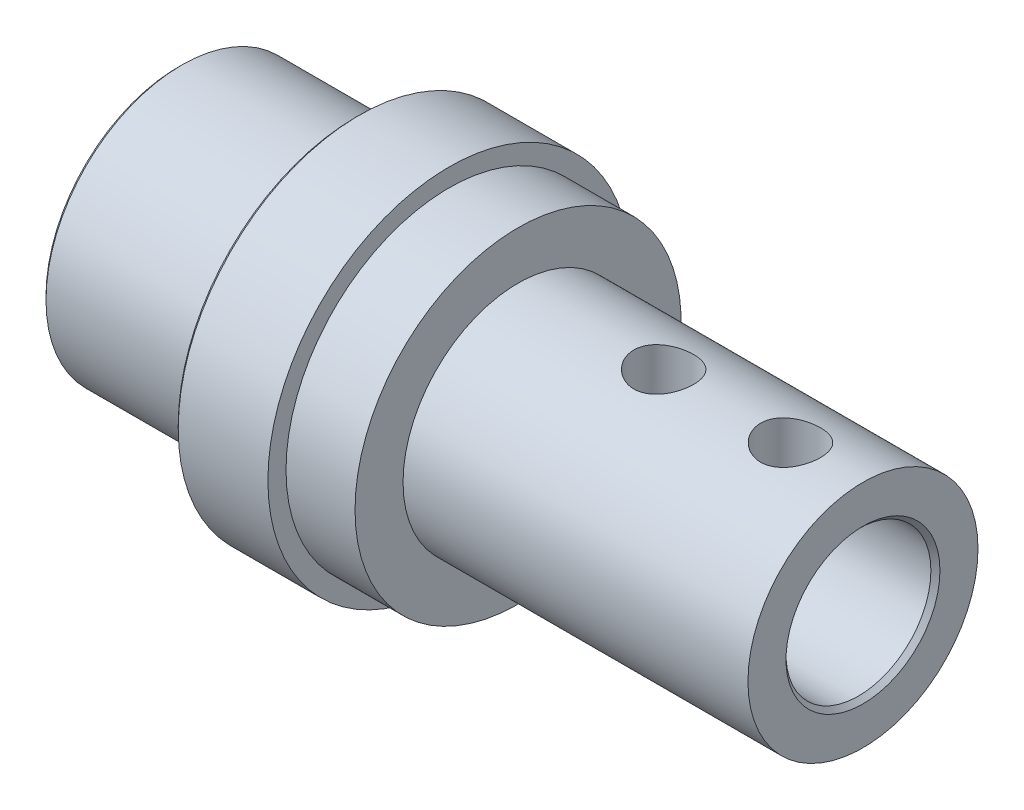
ISO-10303-21;
HEADER;
FILE_DESCRIPTION(('STEP AP214'),'2;1');
FILE_NAME('part.step','',(''),(''),'','','');
FILE_SCHEMA(('AUTOMOTIVE_DESIGN { 1 0 10303 214 1 1 1 1 }'));
ENDSEC;
DATA;
#1=APPLICATION_CONTEXT('core data for automotive mechanical design processes');
#2=APPLICATION_PROTOCOL_DEFINITION('international standard','automotive_design',2000,#1);
#3=PRODUCT_CONTEXT('',#1,'mechanical');
#4=PRODUCT('Part','Part','',(#3));
#5=PRODUCT_RELATED_PRODUCT_CATEGORY('part','',(#4));
#6=PRODUCT_DEFINITION_FORMATION('','',#4);
#7=PRODUCT_DEFINITION_CONTEXT('part definition',#1,'design');
#8=PRODUCT_DEFINITION('design','',#6,#7);
#9=PRODUCT_DEFINITION_SHAPE('','',#8);
#10=(LENGTH_UNIT() NAMED_UNIT(*) SI_UNIT(.MILLI.,.METRE.));
#11=(NAMED_UNIT(*) PLANE_ANGLE_UNIT() SI_UNIT($,.RADIAN.));
#12=(NAMED_UNIT(*) SI_UNIT($,.STERADIAN.) SOLID_ANGLE_UNIT());
#13=UNCERTAINTY_MEASURE_WITH_UNIT(LENGTH_MEASURE(1.E-05),#10,'distance_accuracy_value','');
#14=(GEOMETRIC_REPRESENTATION_CONTEXT(3) GLOBAL_UNCERTAINTY_ASSIGNED_CONTEXT((#13)) GLOBAL_UNIT_ASSIGNED_CONTEXT((#10,
#11,#12)) REPRESENTATION_CONTEXT('',''));
#15=CARTESIAN_POINT('',(0.,0.,0.));
#16=DIRECTION('',(0.,0.,1.));
#17=DIRECTION('',(1.,0.,0.));
#18=AXIS2_PLACEMENT_3D('',#15,#16,#17);
#19=CARTESIAN_POINT('',(16.5,0.,10.2));
#20=DIRECTION('',(1.,0.,0.));
#21=DIRECTION('',(0.,0.,-1.));
#22=AXIS2_PLACEMENT_3D('',#19,#20,#21);
#23=CYLINDRICAL_SURFACE('',#22,10.);
#24=CARTESIAN_POINT('',(-11.3000000000002,0.,10.2));
#25=DIRECTION('',(-1.,0.,0.));
#26=DIRECTION('',(0.,0.,1.));
#27=AXIS2_PLACEMENT_3D('',#24,#25,#26);
#28=CIRCLE('',#27,10.);
#29=CARTESIAN_POINT('',(-11.3000000000002,0.,20.2));
#30=VERTEX_POINT('',#29);
#31=EDGE_CURVE('E92',#30,#30,#28,.F.);
#32=ORIENTED_EDGE('',*,*,#31,.T.);
#33=EDGE_LOOP('',(#32));
#34=FACE_BOUND('',#33,.T.);
#35=CARTESIAN_POINT('',(-6.35,0.,10.2));
#36=DIRECTION('',(-1.,0.,0.));
#37=DIRECTION('',(0.,0.,1.));
#38=AXIS2_PLACEMENT_3D('',#35,#36,#37);
#39=CIRCLE('',#38,10.);
#40=CARTESIAN_POINT('',(-6.35,0.,20.2));
#41=VERTEX_POINT('',#40);
#42=EDGE_CURVE('E225',#41,#41,#39,.T.);
#43=ORIENTED_EDGE('',*,*,#42,.T.);
#44=EDGE_LOOP('',(#43));
#45=FACE_BOUND('',#44,.T.);
#46=ADVANCED_FACE('F46',(#34,#45),#23,.T.);
#47=CARTESIAN_POINT('',(-11.5000000000002,0.,1.7));
#48=DIRECTION('',(-1.,0.,0.));
#49=DIRECTION('',(0.,0.,1.));
#50=AXIS2_PLACEMENT_3D('',#47,#48,#49);
#51=PLANE('',#50);
#52=CARTESIAN_POINT('',(-11.5000000000002,0.,10.2));
#53=DIRECTION('',(-1.,0.,0.));
#54=DIRECTION('',(0.,0.,1.));
#55=AXIS2_PLACEMENT_3D('',#52,#53,#54);
#56=CIRCLE('',#55,9.79999999999999);
#57=CARTESIAN_POINT('',(-11.5000000000002,0.,20.));
#58=VERTEX_POINT('',#57);
#59=EDGE_CURVE('E96',#58,#58,#56,.T.);
#60=ORIENTED_EDGE('',*,*,#59,.T.);
#61=EDGE_LOOP('',(#60));
#62=FACE_BOUND('',#61,.T.);
#63=CARTESIAN_POINT('',(-11.5000000000002,0.,10.2));
#64=DIRECTION('',(1.,0.,0.));
#65=DIRECTION('',(0.,0.,-1.));
#66=AXIS2_PLACEMENT_3D('',#63,#64,#65);
#67=CIRCLE('',#66,8.49999999999999);
#68=CARTESIAN_POINT('',(-11.5000000000002,0.,1.7));
#69=VERTEX_POINT('',#68);
#70=EDGE_CURVE('E82',#69,#69,#67,.T.);
#71=ORIENTED_EDGE('',*,*,#70,.T.);
#72=EDGE_LOOP('',(#71));
#73=FACE_BOUND('',#72,.T.);
#74=ADVANCED_FACE('F130',(#62,#73),#51,.T.);
#75=CARTESIAN_POINT('',(16.5,0.,10.2));
#76=DIRECTION('',(1.,0.,0.));
#77=DIRECTION('',(0.,0.,-1.));
#78=AXIS2_PLACEMENT_3D('',#75,#76,#77);
#79=CYLINDRICAL_SURFACE('',#78,8.5);
#80=CARTESIAN_POINT('',(-12.3000000000002,0.,10.2));
#81=DIRECTION('',(-1.,0.,0.));
#82=DIRECTION('',(0.,0.,1.));
#83=AXIS2_PLACEMENT_3D('',#80,#81,#82);
#84=CIRCLE('',#83,8.5);
#85=CARTESIAN_POINT('',(-12.3000000000002,0.,18.7));
#86=VERTEX_POINT('',#85);
#87=EDGE_CURVE('E100',#86,#86,#84,.F.);
#88=ORIENTED_EDGE('',*,*,#87,.T.);
#89=EDGE_LOOP('',(#88));
#90=FACE_BOUND('',#89,.T.);
#91=ORIENTED_EDGE('',*,*,#70,.F.);
#92=EDGE_LOOP('',(#91));
#93=FACE_BOUND('',#92,.T.);
#94=ADVANCED_FACE('F136',(#90,#93),#79,.T.);
#95=CARTESIAN_POINT('',(-12.5000000000002,0.,2.7));
#96=DIRECTION('',(-1.,0.,0.));
#97=DIRECTION('',(0.,0.,1.));
#98=AXIS2_PLACEMENT_3D('',#95,#96,#97);
#99=PLANE('',#98);
#100=CARTESIAN_POINT('',(-12.5000000000002,0.,10.2));
#101=DIRECTION('',(-1.,0.,0.));
#102=DIRECTION('',(0.,0.,1.));
#103=AXIS2_PLACEMENT_3D('',#100,#101,#102);
#104=CIRCLE('',#103,8.29999999999998);
#105=CARTESIAN_POINT('',(-12.5000000000002,0.,18.5));
#106=VERTEX_POINT('',#105);
#107=EDGE_CURVE('E104',#106,#106,#104,.T.);
#108=ORIENTED_EDGE('',*,*,#107,.T.);
#109=EDGE_LOOP('',(#108));
#110=FACE_BOUND('',#109,.T.);
#111=CARTESIAN_POINT('',(-12.5000000000003,0.,10.2));
#112=DIRECTION('',(1.,0.,0.));
#113=DIRECTION('',(0.,0.,-1.));
#114=AXIS2_PLACEMENT_3D('',#111,#112,#113);
#115=CIRCLE('',#114,7.5);
#116=CARTESIAN_POINT('',(-12.5000000000003,0.,2.7));
#117=VERTEX_POINT('',#116);
#118=EDGE_CURVE('E75',#117,#117,#115,.T.);
#119=ORIENTED_EDGE('',*,*,#118,.T.);
#120=EDGE_LOOP('',(#119));
#121=FACE_BOUND('',#120,.T.);
#122=ADVANCED_FACE('F170',(#110,#121),#99,.T.);
#123=CARTESIAN_POINT('',(16.5,0.,10.2));
#124=DIRECTION('',(1.,0.,0.));
#125=DIRECTION('',(0.,0.,-1.));
#126=AXIS2_PLACEMENT_3D('',#123,#124,#125);
#127=CYLINDRICAL_SURFACE('',#126,7.5);
#128=CARTESIAN_POINT('',(-21.1000000000001,0.,10.2));
#129=DIRECTION('',(-1.,0.,0.));
#130=DIRECTION('',(0.,0.,1.));
#131=AXIS2_PLACEMENT_3D('',#128,#129,#130);
#132=CIRCLE('',#131,7.5);
#133=CARTESIAN_POINT('',(-21.1000000000001,0.,17.7));
#134=VERTEX_POINT('',#133);
#135=EDGE_CURVE('E61',#134,#134,#132,.F.);
#136=ORIENTED_EDGE('',*,*,#135,.T.);
#137=EDGE_LOOP('',(#136));
#138=FACE_BOUND('',#137,.T.);
#139=ORIENTED_EDGE('',*,*,#118,.F.);
#140=EDGE_LOOP('',(#139));
#141=FACE_BOUND('',#140,.T.);
#142=ADVANCED_FACE('F113',(#138,#141),#127,.T.);
#143=CARTESIAN_POINT('',(-21.3000000000001,0.,10.2));
#144=DIRECTION('',(-1.,0.,0.));
#145=DIRECTION('',(0.,0.,1.));
#146=AXIS2_PLACEMENT_3D('',#143,#144,#145);
#147=PLANE('',#146);
#148=CARTESIAN_POINT('',(-21.3000000000001,0.,10.2));
#149=DIRECTION('',(-1.,0.,0.));
#150=DIRECTION('',(0.,0.,1.));
#151=AXIS2_PLACEMENT_3D('',#148,#149,#150);
#152=CIRCLE('',#151,7.29999999999999);
#153=CARTESIAN_POINT('',(-21.3000000000001,0.,17.5));
#154=VERTEX_POINT('',#153);
#155=EDGE_CURVE('E11',#154,#154,#152,.T.);
#156=ORIENTED_EDGE('',*,*,#155,.T.);
#157=EDGE_LOOP('',(#156));
#158=FACE_BOUND('',#157,.T.);
#159=ADVANCED_FACE('F152',(#158),#147,.T.);
#160=CARTESIAN_POINT('',(-11.3000000000002,0.,10.2));
#161=DIRECTION('',(1.,0.,0.));
#162=DIRECTION('',(0.,0.,-1.));
#163=AXIS2_PLACEMENT_3D('',#160,#161,#162);
#164=CONICAL_SURFACE('',#163,10.,0.785398163397431);
#165=ORIENTED_EDGE('',*,*,#59,.F.);
#166=EDGE_LOOP('',(#165));
#167=FACE_BOUND('',#166,.T.);
#168=ORIENTED_EDGE('',*,*,#31,.F.);
#169=EDGE_LOOP('',(#168));
#170=FACE_BOUND('',#169,.T.);
#171=ADVANCED_FACE('F126',(#167,#170),#164,.T.);
#172=CARTESIAN_POINT('',(-12.3000000000002,0.,10.2));
#173=DIRECTION('',(1.,0.,0.));
#174=DIRECTION('',(0.,0.,-1.));
#175=AXIS2_PLACEMENT_3D('',#172,#173,#174);
#176=CONICAL_SURFACE('',#175,8.5,0.785398163397448);
#177=ORIENTED_EDGE('',*,*,#107,.F.);
#178=EDGE_LOOP('',(#177));
#179=FACE_BOUND('',#178,.T.);
#180=ORIENTED_EDGE('',*,*,#87,.F.);
#181=EDGE_LOOP('',(#180));
#182=FACE_BOUND('',#181,.T.);
#183=ADVANCED_FACE('F118',(#179,#182),#176,.T.);
#184=CARTESIAN_POINT('',(-21.1000000000001,0.,10.2));
#185=DIRECTION('',(1.,0.,0.));
#186=DIRECTION('',(0.,0.,-1.));
#187=AXIS2_PLACEMENT_3D('',#184,#185,#186);
#188=CONICAL_SURFACE('',#187,7.5,0.78539816339744);
#189=ORIENTED_EDGE('',*,*,#155,.F.);
#190=EDGE_LOOP('',(#189));
#191=FACE_BOUND('',#190,.T.);
#192=ORIENTED_EDGE('',*,*,#135,.F.);
#193=EDGE_LOOP('',(#192));
#194=FACE_BOUND('',#193,.T.);
#195=ADVANCED_FACE('F49',(#191,#194),#188,.T.);
#196=CARTESIAN_POINT('',(0.,0.,10.2));
#197=DIRECTION('',(-1.,0.,0.));
#198=DIRECTION('',(0.,0.,1.));
#199=AXIS2_PLACEMENT_3D('',#196,#197,#198);
#200=CYLINDRICAL_SURFACE('',#199,6.35);
#201=CARTESIAN_POINT('',(16.5,0.,10.2));
#202=DIRECTION('',(-1.,0.,0.));
#203=DIRECTION('',(0.,0.,1.));
#204=AXIS2_PLACEMENT_3D('',#201,#202,#203);
#205=CIRCLE('',#204,6.35);
#206=CARTESIAN_POINT('',(16.5,0.,16.55));
#207=VERTEX_POINT('',#206);
#208=EDGE_CURVE('E213',#207,#207,#205,.T.);
#209=ORIENTED_EDGE('',*,*,#208,.T.);
#210=EDGE_LOOP('',(#209));
#211=FACE_BOUND('',#210,.T.);
#212=CARTESIAN_POINT('',(-2.54,0.,10.2));
#213=DIRECTION('',(-1.,0.,0.));
#214=DIRECTION('',(0.,0.,1.));
#215=AXIS2_PLACEMENT_3D('',#212,#213,#214);
#216=CIRCLE('',#215,6.35);
#217=CARTESIAN_POINT('',(-2.54,0.,16.55));
#218=VERTEX_POINT('',#217);
#219=EDGE_CURVE('E214',#218,#218,#216,.T.);
#220=ORIENTED_EDGE('',*,*,#219,.F.);
#221=EDGE_LOOP('',(#220));
#222=FACE_BOUND('',#221,.T.);
#223=CARTESIAN_POINT('',(12.5,6.13188388670236,11.85));
#224=CARTESIAN_POINT('',(12.4090136721728,6.13188553974097,11.8499976363243));
#225=CARTESIAN_POINT('',(12.3180018674392,6.1339311300214,11.8424484415352));
#226=CARTESIAN_POINT('',(12.1386004900151,6.14186949481345,11.8125045551441));
#227=CARTESIAN_POINT('',(12.0502123465098,6.14776432732408,11.7901019220464));
#228=CARTESIAN_POINT('',(11.8786793338544,6.16268948392982,11.7312322448828));
#229=CARTESIAN_POINT('',(11.7955275224345,6.17171554866364,11.6947842989885));
#230=CARTESIAN_POINT('',(11.6365074719336,6.19188078325927,11.6089177762146));
#231=CARTESIAN_POINT('',(11.560639693268,6.20302008656419,11.5594983801607));
#232=CARTESIAN_POINT('',(11.41653888418,6.2264531082588,11.4478368888523));
#233=CARTESIAN_POINT('',(11.3485044869894,6.23876646120304,11.3853425230915));
#234=CARTESIAN_POINT('',(11.2237551133751,6.26299035325662,11.2498479726357));
#235=CARTESIAN_POINT('',(11.1670412614466,6.27490085225206,11.176846745509));
#236=CARTESIAN_POINT('',(11.0657210900175,6.29719537033068,11.0210402563193));
#237=CARTESIAN_POINT('',(11.0213112699395,6.30755352225317,10.9381031893388));
#238=CARTESIAN_POINT('',(10.9471396857437,6.3253515123212,10.7656262277974));
#239=CARTESIAN_POINT('',(10.9173755808916,6.33279181676968,10.6760873909885));
#240=CARTESIAN_POINT('',(10.8739804221676,6.34377696958343,10.4950208480997));
#241=CARTESIAN_POINT('',(10.8600117165979,6.34740322613677,10.4035790900542));
#242=CARTESIAN_POINT('',(10.8475425816485,6.35063594138407,10.2195829629698));
#243=CARTESIAN_POINT('',(10.8490396892051,6.35024304016357,10.1270287734401));
#244=CARTESIAN_POINT('',(10.8672197932799,6.34554175382561,9.94578174981583));
#245=CARTESIAN_POINT('',(10.8835381302078,6.34132739539431,9.85704952928106));
#246=CARTESIAN_POINT('',(10.9303095949893,6.32956706077998,9.68362883014714));
#247=CARTESIAN_POINT('',(10.9607635075599,6.32202089963765,9.59894057633112));
#248=CARTESIAN_POINT('',(11.0352275832225,6.30430356599421,9.43506848874762));
#249=CARTESIAN_POINT('',(11.0793646946024,6.29410796246699,9.355945090691));
#250=CARTESIAN_POINT('',(11.179845323999,6.27219339176724,9.20610216805593));
#251=CARTESIAN_POINT('',(11.2361911160533,6.26047414095694,9.13538421291409));
#252=CARTESIAN_POINT('',(11.3614334490824,6.23638166643451,9.00218366489129));
#253=CARTESIAN_POINT('',(11.430648309973,6.22399933862566,8.94000168229715));
#254=CARTESIAN_POINT('',(11.5786523096785,6.20028671836818,8.82805683334184));
#255=CARTESIAN_POINT('',(11.6574419726875,6.18895648357869,8.77829464738615));
#256=CARTESIAN_POINT('',(11.822984859806,6.16859596556769,8.6923884303244));
#257=CARTESIAN_POINT('',(11.9097801949515,6.15957891257177,8.65632219327734));
#258=CARTESIAN_POINT('',(12.0884943899756,6.14503216732012,8.59938993901555));
#259=CARTESIAN_POINT('',(12.18041204721,6.139501660199,8.57852036990277));
#260=CARTESIAN_POINT('',(12.3639600951148,6.13272673240101,8.55308394682766));
#261=CARTESIAN_POINT('',(12.4555243073088,6.13136488687884,8.54807031677842));
#262=CARTESIAN_POINT('',(12.6381820664328,6.13276088410879,8.5532603885131));
#263=CARTESIAN_POINT('',(12.72927565968,6.13551831339115,8.56346256301947));
#264=CARTESIAN_POINT('',(12.9067111032331,6.14472911696835,8.59840164248817));
#265=CARTESIAN_POINT('',(12.9931089807301,6.15111504469164,8.62287351410237));
#266=CARTESIAN_POINT('',(13.1605749139209,6.16679819321596,8.68536105626316));
#267=CARTESIAN_POINT('',(13.2416422985022,6.17609577975075,8.72337842834414));
#268=CARTESIAN_POINT('',(13.3980251849691,6.19679824352577,8.81279649512991));
#269=CARTESIAN_POINT('',(13.4731841014284,6.20824328210405,8.8644615320924));
#270=CARTESIAN_POINT('',(13.6139295571017,6.23185492577481,8.97937795312087));
#271=CARTESIAN_POINT('',(13.6795143875257,6.24402165913228,9.04263140096321));
#272=CARTESIAN_POINT('',(13.8010858779192,6.26810744462941,9.1809889591079));
#273=CARTESIAN_POINT('',(13.8567620081884,6.28001069362144,9.25636920808464));
#274=CARTESIAN_POINT('',(13.9546682026394,6.3018866129425,9.4156666227679));
#275=CARTESIAN_POINT('',(13.9968989792051,6.31185938554421,9.49958333587054));
#276=CARTESIAN_POINT('',(14.0663359250745,6.3286868090298,9.67298338867223));
#277=CARTESIAN_POINT('',(14.0936528480858,6.33556437657373,9.76242004737799));
#278=CARTESIAN_POINT('',(14.1328129713154,6.34552712562432,9.94481858103179));
#279=CARTESIAN_POINT('',(14.1446594149465,6.34861310203662,10.0377797128611));
#280=CARTESIAN_POINT('',(14.1523476975196,6.35060954213632,10.2216806405939));
#281=CARTESIAN_POINT('',(14.148646169765,6.34963914291606,10.3126003305892));
#282=CARTESIAN_POINT('',(14.126397859056,6.34389911049899,10.4924757231607));
#283=CARTESIAN_POINT('',(14.1078515840235,6.33912960729081,10.5814314928265));
#284=CARTESIAN_POINT('',(14.0566930536534,6.32634877587924,10.7543342496057));
#285=CARTESIAN_POINT('',(14.0241692711005,6.31835785750942,10.8383090220497));
#286=CARTESIAN_POINT('',(13.9460583586729,6.29997214989296,10.9996575380986));
#287=CARTESIAN_POINT('',(13.900469470774,6.2895770371773,11.077030391538));
#288=CARTESIAN_POINT('',(13.7961626073455,6.26716709585033,11.225121194709));
#289=CARTESIAN_POINT('',(13.7371389033826,6.25511766534273,11.2956185623933));
#290=CARTESIAN_POINT('',(13.6082234335704,6.23090349817102,11.4258627555158));
#291=CARTESIAN_POINT('',(13.5383288574161,6.21873873245658,11.4856067923957));
#292=CARTESIAN_POINT('',(13.3879245968643,6.19538429010402,11.5938616571269));
#293=CARTESIAN_POINT('',(13.3072260515196,6.18421983395787,11.6421159930622));
#294=CARTESIAN_POINT('',(13.1385820488824,6.1644789264152,11.7243025464332));
#295=CARTESIAN_POINT('',(13.050641606005,6.15590070313313,11.7582445759323));
#296=CARTESIAN_POINT('',(12.8857937772314,6.14355741275248,11.8061438801136));
#297=CARTESIAN_POINT('',(12.8096329869087,6.13921421063347,11.8225524836192));
#298=CARTESIAN_POINT('',(12.6556542335596,6.13337688486827,11.8444810030052));
#299=CARTESIAN_POINT('',(12.5778364392358,6.13188247257078,11.8500020220631));
#300=CARTESIAN_POINT('',(12.5,6.13188388670236,11.85));
#301=B_SPLINE_CURVE_WITH_KNOTS('',3,(#223,#224,#225,#226,#227,#228,#229,#230,#231,#232,#233,
#234,#235,#236,#237,#238,#239,#240,#241,#242,#243,#244,#245,#246,#247,#248,#249,#250,#251,#252,
#253,#254,#255,#256,#257,#258,#259,#260,#261,#262,#263,#264,#265,#266,#267,#268,#269,#270,#271,
#272,#273,#274,#275,#276,#277,#278,#279,#280,#281,#282,#283,#284,#285,#286,#287,#288,#289,#290,
#291,#292,#293,#294,#295,#296,#297,#298,#299,#300),.UNSPECIFIED.,.T.,.F.,(4,2,2,2,2,2,2,2,2,2,2,
2,2,2,2,2,2,2,2,2,2,2,2,2,2,2,2,2,2,2,2,2,2,2,2,2,2,2,4),(0.,0.272672926683555,
0.545491757562702,0.817940923503111,1.09040729931828,1.36871710122714,1.64705453452927,
1.92960985094953,2.21211999361816,2.48846958169582,2.76477515940422,3.03446142923302,
3.30416267211511,3.57644504089438,3.84877816974043,4.12905991840252,4.40935701863625,
4.69122322600104,4.97302353196757,5.24680930902985,5.52056760685324,5.78939636875261,
6.05825891181398,6.33276889460924,6.60732781240531,6.88937426953431,7.17140578032909,
7.4513133402502,7.73116220763909,8.00285046042542,8.27452941763361,8.5445134987058,
8.81453392556818,9.09145439408536,9.36844657060043,9.6511394221074,9.93363815202068,
10.1669263945671,10.400190998117),.UNSPECIFIED.);
#302=CARTESIAN_POINT('',(12.5,6.13188388670236,11.85));
#303=VERTEX_POINT('',#302);
#304=EDGE_CURVE('E51',#303,#303,#301,.T.);
#305=ORIENTED_EDGE('',*,*,#304,.T.);
#306=EDGE_LOOP('',(#305));
#307=FACE_BOUND('',#306,.T.);
#308=CARTESIAN_POINT('',(5.49999999999998,6.13188388670236,11.85));
#309=CARTESIAN_POINT('',(5.40901367217284,6.13188553974097,11.8499976363244));
#310=CARTESIAN_POINT('',(5.31800186743921,6.1339311300214,11.8424484415352));
#311=CARTESIAN_POINT('',(5.13860049001509,6.14186949481345,11.8125045551441));
#312=CARTESIAN_POINT('',(5.05021234650975,6.14776432732408,11.7901019220464));
#313=CARTESIAN_POINT('',(4.87867933385443,6.16268948392982,11.7312322448828));
#314=CARTESIAN_POINT('',(4.79552752243448,6.17171554866364,11.6947842989885));
#315=CARTESIAN_POINT('',(4.6365074719336,6.19188078325927,11.6089177762146));
#316=CARTESIAN_POINT('',(4.56063969326797,6.20302008656419,11.5594983801607));
#317=CARTESIAN_POINT('',(4.41653888418002,6.2264531082588,11.4478368888524));
#318=CARTESIAN_POINT('',(4.34850448698936,6.23876646120304,11.3853425230915));
#319=CARTESIAN_POINT('',(4.22375511337509,6.26299035325661,11.2498479726357));
#320=CARTESIAN_POINT('',(4.16704126144656,6.27490085225206,11.176846745509));
#321=CARTESIAN_POINT('',(4.06572109001747,6.29719537033068,11.0210402563193));
#322=CARTESIAN_POINT('',(4.02131126993948,6.30755352225317,10.9381031893388));
#323=CARTESIAN_POINT('',(3.94713968574367,6.3253515123212,10.7656262277974));
#324=CARTESIAN_POINT('',(3.9173755808916,6.33279181676968,10.6760873909885));
#325=CARTESIAN_POINT('',(3.87398042216757,6.34377696958343,10.4950208480997));
#326=CARTESIAN_POINT('',(3.86001171659788,6.34740322613677,10.4035790900543));
#327=CARTESIAN_POINT('',(3.84754258164851,6.35063594138407,10.2195829629698));
#328=CARTESIAN_POINT('',(3.84903968920513,6.35024304016357,10.1270287734401));
#329=CARTESIAN_POINT('',(3.86721979327987,6.34554175382561,9.94578174981583));
#330=CARTESIAN_POINT('',(3.88353813020784,6.34132739539431,9.85704952928107));
#331=CARTESIAN_POINT('',(3.93030959498931,6.32956706077998,9.68362883014714));
#332=CARTESIAN_POINT('',(3.96076350755987,6.32202089963765,9.59894057633113));
#333=CARTESIAN_POINT('',(4.03522758322249,6.30430356599421,9.43506848874763));
#334=CARTESIAN_POINT('',(4.07936469460237,6.29410796246699,9.355945090691));
#335=CARTESIAN_POINT('',(4.17984532399898,6.27219339176724,9.20610216805593));
#336=CARTESIAN_POINT('',(4.23619111605332,6.26047414095694,9.13538421291409));
#337=CARTESIAN_POINT('',(4.36143344908244,6.23638166643451,9.0021836648913));
#338=CARTESIAN_POINT('',(4.43064830997297,6.22399933862566,8.94000168229716));
#339=CARTESIAN_POINT('',(4.57865230967849,6.20028671836818,8.82805683334185));
#340=CARTESIAN_POINT('',(4.65744197268749,6.1889564835787,8.77829464738616));
#341=CARTESIAN_POINT('',(4.82298485980601,6.16859596556769,8.69238843032441));
#342=CARTESIAN_POINT('',(4.90978019495147,6.15957891257177,8.65632219327735));
#343=CARTESIAN_POINT('',(5.08849438997559,6.14503216732012,8.59938993901556));
#344=CARTESIAN_POINT('',(5.18041204720996,6.139501660199,8.57852036990278));
#345=CARTESIAN_POINT('',(5.36396009511475,6.13272673240101,8.55308394682766));
#346=CARTESIAN_POINT('',(5.45552430730876,6.13136488687884,8.54807031677843));
#347=CARTESIAN_POINT('',(5.63818206643278,6.13276088410879,8.55326038851311));
#348=CARTESIAN_POINT('',(5.72927565967998,6.13551831339115,8.56346256301948));
#349=CARTESIAN_POINT('',(5.90671110323314,6.14472911696836,8.59840164248818));
#350=CARTESIAN_POINT('',(5.99310898073013,6.15111504469164,8.62287351410238));
#351=CARTESIAN_POINT('',(6.16057491392086,6.16679819321596,8.68536105626317));
#352=CARTESIAN_POINT('',(6.24164229850216,6.17609577975075,8.72337842834414));
#353=CARTESIAN_POINT('',(6.39802518496906,6.19679824352577,8.81279649512992));
#354=CARTESIAN_POINT('',(6.47318410142837,6.20824328210405,8.86446153209241));
#355=CARTESIAN_POINT('',(6.6139295571017,6.23185492577481,8.97937795312088));
#356=CARTESIAN_POINT('',(6.67951438752569,6.24402165913229,9.04263140096322));
#357=CARTESIAN_POINT('',(6.80108587791923,6.26810744462941,9.1809889591079));
#358=CARTESIAN_POINT('',(6.85676200818836,6.28001069362144,9.25636920808465));
#359=CARTESIAN_POINT('',(6.95466820263945,6.3018866129425,9.41566662276791));
#360=CARTESIAN_POINT('',(6.99689897920512,6.31185938554421,9.49958333587055));
#361=CARTESIAN_POINT('',(7.06633592507453,6.3286868090298,9.67298338867224));
#362=CARTESIAN_POINT('',(7.09365284808585,6.33556437657373,9.76242004737801));
#363=CARTESIAN_POINT('',(7.13281297131537,6.34552712562432,9.94481858103181));
#364=CARTESIAN_POINT('',(7.14465941494646,6.34861310203662,10.0377797128611));
#365=CARTESIAN_POINT('',(7.15234769751965,6.35060954213632,10.2216806405939));
#366=CARTESIAN_POINT('',(7.14864616976499,6.34963914291606,10.3126003305892));
#367=CARTESIAN_POINT('',(7.12639785905598,6.34389911049899,10.4924757231607));
#368=CARTESIAN_POINT('',(7.10785158402349,6.33912960729081,10.5814314928265));
#369=CARTESIAN_POINT('',(7.05669305365335,6.32634877587924,10.7543342496057));
#370=CARTESIAN_POINT('',(7.02416927110049,6.31835785750941,10.8383090220497));
#371=CARTESIAN_POINT('',(6.9460583586729,6.29997214989296,10.9996575380986));
#372=CARTESIAN_POINT('',(6.90046947077399,6.2895770371773,11.077030391538));
#373=CARTESIAN_POINT('',(6.79616260734547,6.26716709585033,11.225121194709));
#374=CARTESIAN_POINT('',(6.73713890338258,6.25511766534272,11.2956185623933));
#375=CARTESIAN_POINT('',(6.60822343357036,6.23090349817102,11.4258627555158));
#376=CARTESIAN_POINT('',(6.53832885741606,6.21873873245658,11.4856067923957));
#377=CARTESIAN_POINT('',(6.38792459686432,6.19538429010402,11.5938616571269));
#378=CARTESIAN_POINT('',(6.30722605151958,6.18421983395787,11.6421159930622));
#379=CARTESIAN_POINT('',(6.13858204888243,6.16447892641519,11.7243025464332));
#380=CARTESIAN_POINT('',(6.05064160600503,6.15590070313312,11.7582445759323));
#381=CARTESIAN_POINT('',(5.88579377723136,6.14355741275248,11.8061438801136));
#382=CARTESIAN_POINT('',(5.80963298690865,6.13921421063347,11.8225524836192));
#383=CARTESIAN_POINT('',(5.65565423355958,6.13337688486827,11.8444810030052));
#384=CARTESIAN_POINT('',(5.57783643923579,6.13188247257078,11.8500020220631));
#385=CARTESIAN_POINT('',(5.49999999999998,6.13188388670236,11.85));
#386=B_SPLINE_CURVE_WITH_KNOTS('',3,(#308,#309,#310,#311,#312,#313,#314,#315,#316,#317,#318,
#319,#320,#321,#322,#323,#324,#325,#326,#327,#328,#329,#330,#331,#332,#333,#334,#335,#336,#337,
#338,#339,#340,#341,#342,#343,#344,#345,#346,#347,#348,#349,#350,#351,#352,#353,#354,#355,#356,
#357,#358,#359,#360,#361,#362,#363,#364,#365,#366,#367,#368,#369,#370,#371,#372,#373,#374,#375,
#376,#377,#378,#379,#380,#381,#382,#383,#384,#385),.UNSPECIFIED.,.T.,.F.,(4,2,2,2,2,2,2,2,2,2,2,
2,2,2,2,2,2,2,2,2,2,2,2,2,2,2,2,2,2,2,2,2,2,2,2,2,2,2,4),(0.,0.272672926683556,
0.545491757562703,0.817940923503114,1.09040729931828,1.36871710122714,1.64705453452927,
1.92960985094953,2.21211999361816,2.48846958169582,2.76477515940422,3.03446142923302,
3.30416267211512,3.57644504089439,3.84877816974043,4.12905991840252,4.40935701863625,
4.69122322600105,4.97302353196757,5.24680930902985,5.52056760685324,5.78939636875261,
6.05825891181398,6.33276889460924,6.60732781240531,6.8893742695343,7.17140578032909,
7.4513133402502,7.7311622076391,8.00285046042542,8.27452941763361,8.5445134987058,
8.81453392556818,9.09145439408536,9.36844657060044,9.65113942210741,9.93363815202068,
10.1669263945671,10.400190998117),.UNSPECIFIED.);
#387=CARTESIAN_POINT('',(5.49999999999998,6.13188388670236,11.85));
#388=VERTEX_POINT('',#387);
#389=EDGE_CURVE('E227',#388,#388,#386,.T.);
#390=ORIENTED_EDGE('',*,*,#389,.T.);
#391=EDGE_LOOP('',(#390));
#392=FACE_BOUND('',#391,.T.);
#393=ADVANCED_FACE('F117',(#211,#222,#307,#392),#200,.T.);
#394=CARTESIAN_POINT('',(-6.35,10.,10.2));
#395=DIRECTION('',(1.,0.,0.));
#396=DIRECTION('',(0.,0.,-1.));
#397=AXIS2_PLACEMENT_3D('',#394,#395,#396);
#398=PLANE('',#397);
#399=CARTESIAN_POINT('',(-6.35,0.,10.2));
#400=DIRECTION('',(-1.,0.,0.));
#401=DIRECTION('',(0.,0.,1.));
#402=AXIS2_PLACEMENT_3D('',#399,#400,#401);
#403=CIRCLE('',#402,8.99999999999999);
#404=CARTESIAN_POINT('',(-6.35,0.,19.2));
#405=VERTEX_POINT('',#404);
#406=EDGE_CURVE('E222',#405,#405,#403,.T.);
#407=ORIENTED_EDGE('',*,*,#406,.T.);
#408=EDGE_LOOP('',(#407));
#409=FACE_BOUND('',#408,.T.);
#410=ORIENTED_EDGE('',*,*,#42,.F.);
#411=EDGE_LOOP('',(#410));
#412=FACE_BOUND('',#411,.T.);
#413=ADVANCED_FACE('F124',(#409,#412),#398,.T.);
#414=CARTESIAN_POINT('',(0.,0.,10.2));
#415=DIRECTION('',(-1.,0.,0.));
#416=DIRECTION('',(0.,0.,1.));
#417=AXIS2_PLACEMENT_3D('',#414,#415,#416);
#418=CYLINDRICAL_SURFACE('',#417,8.99999999999999);
#419=CARTESIAN_POINT('',(-2.54,0.,10.2));
#420=DIRECTION('',(-1.,0.,0.));
#421=DIRECTION('',(0.,0.,1.));
#422=AXIS2_PLACEMENT_3D('',#419,#420,#421);
#423=CIRCLE('',#422,8.99999999999999);
#424=CARTESIAN_POINT('',(-2.54,0.,19.2));
#425=VERTEX_POINT('',#424);
#426=EDGE_CURVE('E217',#425,#425,#423,.T.);
#427=ORIENTED_EDGE('',*,*,#426,.T.);
#428=EDGE_LOOP('',(#427));
#429=FACE_BOUND('',#428,.T.);
#430=ORIENTED_EDGE('',*,*,#406,.F.);
#431=EDGE_LOOP('',(#430));
#432=FACE_BOUND('',#431,.T.);
#433=ADVANCED_FACE('F237',(#429,#432),#418,.T.);
#434=CARTESIAN_POINT('',(-2.54,8.99999999999999,10.2));
#435=DIRECTION('',(1.,0.,0.));
#436=DIRECTION('',(0.,0.,-1.));
#437=AXIS2_PLACEMENT_3D('',#434,#435,#436);
#438=PLANE('',#437);
#439=ORIENTED_EDGE('',*,*,#219,.T.);
#440=EDGE_LOOP('',(#439));
#441=FACE_BOUND('',#440,.T.);
#442=ORIENTED_EDGE('',*,*,#426,.F.);
#443=EDGE_LOOP('',(#442));
#444=FACE_BOUND('',#443,.T.);
#445=ADVANCED_FACE('F68',(#441,#444),#438,.T.);
#446=CARTESIAN_POINT('',(0.500000000000042,0.,10.2));
#447=DIRECTION('',(1.,0.,0.));
#448=DIRECTION('',(0.,0.,-1.));
#449=AXIS2_PLACEMENT_3D('',#446,#447,#448);
#450=CONICAL_SURFACE('',#449,4.,1.02974425867665);
#451=CARTESIAN_POINT('',(-1.9034424761102,0.,10.2));
#452=VERTEX_POINT('',#451);
#453=VERTEX_LOOP('',#452);
#454=FACE_BOUND('',#453,.T.);
#455=CARTESIAN_POINT('',(0.500000000000042,0.,10.2));
#456=DIRECTION('',(1.,0.,0.));
#457=DIRECTION('',(0.,0.,-1.));
#458=AXIS2_PLACEMENT_3D('',#455,#456,#457);
#459=CIRCLE('',#458,4.);
#460=CARTESIAN_POINT('',(0.500000000000042,0.,6.20000000000001));
#461=VERTEX_POINT('',#460);
#462=EDGE_CURVE('E72',#461,#461,#459,.T.);
#463=ORIENTED_EDGE('',*,*,#462,.T.);
#464=EDGE_LOOP('',(#463));
#465=FACE_BOUND('',#464,.T.);
#466=ADVANCED_FACE('F64',(#454,#465),#450,.F.);
#467=CARTESIAN_POINT('',(5.49999999999998,9.99999999999999,10.2));
#468=DIRECTION('',(0.,1.,0.));
#469=DIRECTION('',(0.,0.,1.));
#470=AXIS2_PLACEMENT_3D('',#467,#468,#469);
#471=CYLINDRICAL_SURFACE('',#470,1.65);
#472=CARTESIAN_POINT('',(5.49999999999998,3.64383040220041,11.85));
#473=CARTESIAN_POINT('',(5.58809648022566,3.64383945275153,11.849990568131));
#474=CARTESIAN_POINT('',(5.67634043197357,3.64707173267573,11.8428998917736));
#475=CARTESIAN_POINT('',(5.85028706107886,3.65959209124688,11.8148084554637));
#476=CARTESIAN_POINT('',(5.93598210059758,3.66889676295874,11.7937695789634));
#477=CARTESIAN_POINT('',(6.10200293813061,3.69231325052125,11.7387353624964));
#478=CARTESIAN_POINT('',(6.18234882021858,3.70640571161012,11.7047921240017));
#479=CARTESIAN_POINT('',(6.3361817668342,3.73778230052357,11.6250653559421));
#480=CARTESIAN_POINT('',(6.40967054278402,3.75506562873472,11.579284791596));
#481=CARTESIAN_POINT('',(6.55222868784648,3.7920553041855,11.4741985629037));
#482=CARTESIAN_POINT('',(6.62082925578019,3.81184277704779,11.4142851824136));
#483=CARTESIAN_POINT('',(6.74735477190874,3.85094363418238,11.2839107216548));
#484=CARTESIAN_POINT('',(6.8052756514722,3.87025683535296,11.2134456399636));
#485=CARTESIAN_POINT('',(6.91117137130184,3.90721575035942,11.0603019435934));
#486=CARTESIAN_POINT('',(6.95862093270614,3.92475616703247,10.9772323901136));
#487=CARTESIAN_POINT('',(7.03867014532168,3.95520283117798,10.8034363618759));
#488=CARTESIAN_POINT('',(7.07127626434654,3.96811109652272,10.712713242513));
#489=CARTESIAN_POINT('',(7.11902070665621,3.98726403378776,10.5311051723044));
#490=CARTESIAN_POINT('',(7.13496684792321,3.99381564337609,10.4404656251845));
#491=CARTESIAN_POINT('',(7.15154665185515,4.0006306156112,10.2575763551499));
#492=CARTESIAN_POINT('',(7.15218639532199,4.00089647540931,10.165327286229));
#493=CARTESIAN_POINT('',(7.13856350386338,3.99529224160632,9.98770261910401));
#494=CARTESIAN_POINT('',(7.12518781628288,3.98978733384658,9.9022453345996));
#495=CARTESIAN_POINT('',(7.08543118255222,3.97375926025944,9.73491415476472));
#496=CARTESIAN_POINT('',(7.0590492787093,3.96323572489496,9.65304052379451));
#497=CARTESIAN_POINT('',(6.9937123382798,3.93798907731602,9.49370439318277));
#498=CARTESIAN_POINT('',(6.95457201007511,3.92320447216362,9.41632802023753));
#499=CARTESIAN_POINT('',(6.86500872081338,3.89088763760773,9.26903951000754));
#500=CARTESIAN_POINT('',(6.81458179949667,3.87335444442336,9.19913000546068));
#501=CARTESIAN_POINT('',(6.69981176097135,3.83587133640027,9.0636146905296));
#502=CARTESIAN_POINT('',(6.63474658910126,3.8158381454309,8.99864253681355));
#503=CARTESIAN_POINT('',(6.49459033367841,3.77653142784555,8.88026161576507));
#504=CARTESIAN_POINT('',(6.41949555073668,3.75725818494773,8.82685713427798));
#505=CARTESIAN_POINT('',(6.25840159645267,3.72106607156909,8.73154660155172));
#506=CARTESIAN_POINT('',(6.17213242830733,3.70424107982558,8.69005820690723));
#507=CARTESIAN_POINT('',(5.99295332859408,3.67596385006485,8.62245491872905));
#508=CARTESIAN_POINT('',(5.90004808612616,3.66450786071417,8.59632928793879));
#509=CARTESIAN_POINT('',(5.71657710481499,3.64919091711418,8.56178679644059));
#510=CARTESIAN_POINT('',(5.62624169881712,3.64489111171831,8.55234430545319));
#511=CARTESIAN_POINT('',(5.44519437030138,3.64311980380967,8.54842898327174));
#512=CARTESIAN_POINT('',(5.3544825839407,3.64564601607449,8.55395114219598));
#513=CARTESIAN_POINT('',(5.18119899095051,3.65678944366161,8.57887289498174));
#514=CARTESIAN_POINT('',(5.09847182032537,3.66501803861664,8.59738797881457));
#515=CARTESIAN_POINT('',(4.93736293562001,3.68614612916707,8.64660419737985));
#516=CARTESIAN_POINT('',(4.85898222864832,3.69904670212356,8.67730814302877));
#517=CARTESIAN_POINT('',(4.70512099430434,3.72872477858182,8.75146097795016));
#518=CARTESIAN_POINT('',(4.62989980522074,3.74564214050945,8.79539020691736));
#519=CARTESIAN_POINT('',(4.48753983057025,3.78124523189864,8.89426544590549));
#520=CARTESIAN_POINT('',(4.42040451226486,3.79993171387674,8.94921615526317));
#521=CARTESIAN_POINT('',(4.29057037355327,3.83876011670653,9.07372457837902));
#522=CARTESIAN_POINT('',(4.22864826295126,3.85889967217623,9.14409612873296));
#523=CARTESIAN_POINT('',(4.11735714433792,3.89698114804694,9.2947020199199));
#524=CARTESIAN_POINT('',(4.06798894799678,3.91492292631236,9.3749369979731));
#525=CARTESIAN_POINT('',(3.98329586579319,3.94668767391886,9.54348318311673));
#526=CARTESIAN_POINT('',(3.94799652499725,3.96050313975063,9.63180872612951));
#527=CARTESIAN_POINT('',(3.89300834314124,3.98237104121021,9.81385916639482));
#528=CARTESIAN_POINT('',(3.87331041706104,3.9904268305481,9.90758088718244));
#529=CARTESIAN_POINT('',(3.8512117710795,3.9994889299446,10.0908128104552));
#530=CARTESIAN_POINT('',(3.84771517125804,4.00094173424749,10.1801696918814));
#531=CARTESIAN_POINT('',(3.85518543437026,3.99786220239438,10.3581617391954));
#532=CARTESIAN_POINT('',(3.86614984999544,3.99333087896147,10.4467970246485));
#533=CARTESIAN_POINT('',(3.90144464213554,3.979024148364,10.6177053759359));
#534=CARTESIAN_POINT('',(3.92530444211453,3.96943363922013,10.7000923716278));
#535=CARTESIAN_POINT('',(3.98520411487997,3.94605480923815,10.8596673557342));
#536=CARTESIAN_POINT('',(4.02124632478666,3.93226568297162,10.9368543431487));
#537=CARTESIAN_POINT('',(4.10630452668637,3.90105808483759,11.0876611337326));
#538=CARTESIAN_POINT('',(4.15583125677291,3.88350423911689,11.1609642143611));
#539=CARTESIAN_POINT('',(4.26570284678998,3.84685709666619,11.298529321707));
#540=CARTESIAN_POINT('',(4.32605162308079,3.82776324400832,11.3627880603165));
#541=CARTESIAN_POINT('',(4.46058752735464,3.78859741195737,11.4848776994505));
#542=CARTESIAN_POINT('',(4.53542775688492,3.76854475207571,11.5419976794716));
#543=CARTESIAN_POINT('',(4.69426597568105,3.73105419200533,11.6429647467733));
#544=CARTESIAN_POINT('',(4.77826899170957,3.71361773967119,11.686804498119));
#545=CARTESIAN_POINT('',(4.95272844126987,3.68370387904713,11.7594444776665));
#546=CARTESIAN_POINT('',(5.04313910809108,3.67119480418033,11.7883411287523));
#547=CARTESIAN_POINT('',(5.22804714407834,3.65281837075147,11.8301726356757));
#548=CARTESIAN_POINT('',(5.32252969087685,3.64692873900432,11.8431610331297));
#549=CARTESIAN_POINT('',(5.44486331364262,3.64414054419779,11.8493120932942));
#550=CARTESIAN_POINT('',(5.472424432285,3.64382756923722,11.8500029523216));
#551=CARTESIAN_POINT('',(5.49999999999998,3.64383040220041,11.85));
#552=B_SPLINE_CURVE_WITH_KNOTS('',3,(#472,#473,#474,#475,#476,#477,#478,#479,#480,#481,#482,
#483,#484,#485,#486,#487,#488,#489,#490,#491,#492,#493,#494,#495,#496,#497,#498,#499,#500,#501,
#502,#503,#504,#505,#506,#507,#508,#509,#510,#511,#512,#513,#514,#515,#516,#517,#518,#519,#520,
#521,#522,#523,#524,#525,#526,#527,#528,#529,#530,#531,#532,#533,#534,#535,#536,#537,#538,#539,
#540,#541,#542,#543,#544,#545,#546,#547,#548,#549,#550,#551),.UNSPECIFIED.,.T.,.F.,(4,2,2,2,2,2,
2,2,2,2,2,2,2,2,2,2,2,2,2,2,2,2,2,2,2,2,2,2,2,2,2,2,2,2,2,2,2,2,2,4),(0.,0.264211724660745,
0.529148459018597,0.793026677872048,1.05683885985756,1.33523297260792,1.61373292676209,
1.90403076094908,2.19420198072699,2.46953816244269,2.74476495901023,3.00356896819766,
3.26239203686791,3.52515526924739,3.78801084539545,4.06907613148064,4.35024537535724,
4.64031806272423,4.9301877724111,5.20152035698263,5.47276211576042,5.72713321026165,
5.9815630002888,6.24665916965708,6.51186861189123,6.79815687284346,7.08446363898862,
7.3712879145617,7.6579450434915,7.92489841526078,8.19180661499934,8.44957452423758,
8.70739191275387,8.97680852354694,9.24632283025306,9.53374725602174,9.82133016535515,
10.1070334851925,10.3917725616093,10.4744749384331),.UNSPECIFIED.);
#553=CARTESIAN_POINT('',(5.49999999999998,3.64383040220041,11.85));
#554=VERTEX_POINT('',#553);
#555=EDGE_CURVE('E193',#554,#554,#552,.T.);
#556=ORIENTED_EDGE('',*,*,#555,.F.);
#557=EDGE_LOOP('',(#556));
#558=FACE_BOUND('',#557,.T.);
#559=ORIENTED_EDGE('',*,*,#389,.F.);
#560=EDGE_LOOP('',(#559));
#561=FACE_BOUND('',#560,.T.);
#562=ADVANCED_FACE('F67',(#558,#561),#471,.F.);
#563=CARTESIAN_POINT('',(16.5,0.,10.2));
#564=DIRECTION('',(1.,0.,0.));
#565=DIRECTION('',(0.,0.,-1.));
#566=AXIS2_PLACEMENT_3D('',#563,#564,#565);
#567=CYLINDRICAL_SURFACE('',#566,4.);
#568=CARTESIAN_POINT('',(12.5,3.64383040220041,11.85));
#569=CARTESIAN_POINT('',(12.5880964802257,3.64383945275153,11.849990568131));
#570=CARTESIAN_POINT('',(12.6763404319736,3.64707173267573,11.8428998917736));
#571=CARTESIAN_POINT('',(12.8502870610789,3.65959209124688,11.8148084554637));
#572=CARTESIAN_POINT('',(12.9359821005976,3.66889676295874,11.7937695789634));
#573=CARTESIAN_POINT('',(13.1020029381306,3.69231325052126,11.7387353624964));
#574=CARTESIAN_POINT('',(13.1823488202186,3.70640571161012,11.7047921240017));
#575=CARTESIAN_POINT('',(13.3361817668342,3.73778230052357,11.6250653559421));
#576=CARTESIAN_POINT('',(13.409670542784,3.75506562873473,11.5792847915959));
#577=CARTESIAN_POINT('',(13.5522286878465,3.7920553041855,11.4741985629037));
#578=CARTESIAN_POINT('',(13.6208292557802,3.81184277704779,11.4142851824136));
#579=CARTESIAN_POINT('',(13.7473547719087,3.85094363418238,11.2839107216548));
#580=CARTESIAN_POINT('',(13.8052756514722,3.87025683535296,11.2134456399636));
#581=CARTESIAN_POINT('',(13.9111713713018,3.90721575035942,11.0603019435934));
#582=CARTESIAN_POINT('',(13.9586209327061,3.92475616703247,10.9772323901136));
#583=CARTESIAN_POINT('',(14.0386701453217,3.95520283117798,10.8034363618758));
#584=CARTESIAN_POINT('',(14.0712762643465,3.96811109652272,10.712713242513));
#585=CARTESIAN_POINT('',(14.1190207066562,3.98726403378776,10.5311051723044));
#586=CARTESIAN_POINT('',(14.1349668479232,3.99381564337609,10.4404656251845));
#587=CARTESIAN_POINT('',(14.1515466518552,4.0006306156112,10.2575763551499));
#588=CARTESIAN_POINT('',(14.152186395322,4.00089647540931,10.165327286229));
#589=CARTESIAN_POINT('',(14.1385635038634,3.99529224160632,9.98770261910401));
#590=CARTESIAN_POINT('',(14.1251878162829,3.98978733384658,9.9022453345996));
#591=CARTESIAN_POINT('',(14.0854311825522,3.97375926025944,9.73491415476472));
#592=CARTESIAN_POINT('',(14.0590492787093,3.96323572489496,9.6530405237945));
#593=CARTESIAN_POINT('',(13.9937123382798,3.93798907731602,9.49370439318276));
#594=CARTESIAN_POINT('',(13.9545720100751,3.92320447216362,9.41632802023753));
#595=CARTESIAN_POINT('',(13.8650087208134,3.89088763760773,9.26903951000753));
#596=CARTESIAN_POINT('',(13.8145817994967,3.87335444442336,9.19913000546068));
#597=CARTESIAN_POINT('',(13.6998117609713,3.83587133640027,9.06361469052959));
#598=CARTESIAN_POINT('',(13.6347465891013,3.81583814543089,8.99864253681354));
#599=CARTESIAN_POINT('',(13.4945903336784,3.77653142784555,8.88026161576506));
#600=CARTESIAN_POINT('',(13.4194955507367,3.75725818494772,8.82685713427797));
#601=CARTESIAN_POINT('',(13.2584015964527,3.72106607156909,8.73154660155171));
#602=CARTESIAN_POINT('',(13.1721324283073,3.70424107982557,8.69005820690723));
#603=CARTESIAN_POINT('',(12.9929533285941,3.67596385006485,8.62245491872904));
#604=CARTESIAN_POINT('',(12.9000480861262,3.66450786071417,8.59632928793878));
#605=CARTESIAN_POINT('',(12.716577104815,3.64919091711418,8.56178679644058));
#606=CARTESIAN_POINT('',(12.6262416988171,3.64489111171831,8.55234430545318));
#607=CARTESIAN_POINT('',(12.4451943703014,3.64311980380967,8.54842898327173));
#608=CARTESIAN_POINT('',(12.3544825839407,3.64564601607449,8.55395114219598));
#609=CARTESIAN_POINT('',(12.1811989909505,3.6567894436616,8.57887289498173));
#610=CARTESIAN_POINT('',(12.0984718203254,3.66501803861664,8.59738797881457));
#611=CARTESIAN_POINT('',(11.93736293562,3.68614612916707,8.64660419737985));
#612=CARTESIAN_POINT('',(11.8589822286483,3.69904670212356,8.67730814302876));
#613=CARTESIAN_POINT('',(11.7051209943043,3.72872477858182,8.75146097795015));
#614=CARTESIAN_POINT('',(11.6298998052207,3.74564214050945,8.79539020691736));
#615=CARTESIAN_POINT('',(11.4875398305702,3.78124523189863,8.89426544590548));
#616=CARTESIAN_POINT('',(11.4204045122649,3.79993171387674,8.94921615526316));
#617=CARTESIAN_POINT('',(11.2905703735533,3.83876011670653,9.07372457837901));
#618=CARTESIAN_POINT('',(11.2286482629513,3.85889967217622,9.14409612873296));
#619=CARTESIAN_POINT('',(11.1173571443379,3.89698114804694,9.29470201991989));
#620=CARTESIAN_POINT('',(11.0679889479968,3.91492292631236,9.37493699797309));
#621=CARTESIAN_POINT('',(10.9832958657932,3.94668767391886,9.54348318311672));
#622=CARTESIAN_POINT('',(10.9479965249973,3.96050313975063,9.6318087261295));
#623=CARTESIAN_POINT('',(10.8930083431412,3.98237104121021,9.81385916639481));
#624=CARTESIAN_POINT('',(10.873310417061,3.9904268305481,9.90758088718243));
#625=CARTESIAN_POINT('',(10.8512117710795,3.9994889299446,10.0908128104552));
#626=CARTESIAN_POINT('',(10.847715171258,4.00094173424749,10.1801696918814));
#627=CARTESIAN_POINT('',(10.8551854343703,3.99786220239438,10.3581617391954));
#628=CARTESIAN_POINT('',(10.8661498499954,3.99333087896147,10.4467970246485));
#629=CARTESIAN_POINT('',(10.9014446421355,3.979024148364,10.6177053759359));
#630=CARTESIAN_POINT('',(10.9253044421145,3.96943363922013,10.7000923716278));
#631=CARTESIAN_POINT('',(10.98520411488,3.94605480923816,10.8596673557342));
#632=CARTESIAN_POINT('',(11.0212463247867,3.93226568297162,10.9368543431487));
#633=CARTESIAN_POINT('',(11.1063045266864,3.90105808483759,11.0876611337326));
#634=CARTESIAN_POINT('',(11.1558312567729,3.88350423911689,11.1609642143611));
#635=CARTESIAN_POINT('',(11.26570284679,3.84685709666619,11.298529321707));
#636=CARTESIAN_POINT('',(11.3260516230808,3.82776324400832,11.3627880603165));
#637=CARTESIAN_POINT('',(11.4605875273546,3.78859741195738,11.4848776994505));
#638=CARTESIAN_POINT('',(11.5354277568849,3.76854475207571,11.5419976794716));
#639=CARTESIAN_POINT('',(11.694265975681,3.73105419200534,11.6429647467733));
#640=CARTESIAN_POINT('',(11.7782689917096,3.7136177396712,11.686804498119));
#641=CARTESIAN_POINT('',(11.9527284412699,3.68370387904713,11.7594444776665));
#642=CARTESIAN_POINT('',(12.0431391080911,3.67119480418034,11.7883411287523));
#643=CARTESIAN_POINT('',(12.2280471440783,3.65281837075147,11.8301726356757));
#644=CARTESIAN_POINT('',(12.3225296908768,3.64692873900432,11.8431610331297));
#645=CARTESIAN_POINT('',(12.4448633136426,3.64414054419779,11.8493120932942));
#646=CARTESIAN_POINT('',(12.472424432285,3.64382756923723,11.8500029523216));
#647=CARTESIAN_POINT('',(12.5,3.64383040220041,11.85));
#648=B_SPLINE_CURVE_WITH_KNOTS('',3,(#568,#569,#570,#571,#572,#573,#574,#575,#576,#577,#578,
#579,#580,#581,#582,#583,#584,#585,#586,#587,#588,#589,#590,#591,#592,#593,#594,#595,#596,#597,
#598,#599,#600,#601,#602,#603,#604,#605,#606,#607,#608,#609,#610,#611,#612,#613,#614,#615,#616,
#617,#618,#619,#620,#621,#622,#623,#624,#625,#626,#627,#628,#629,#630,#631,#632,#633,#634,#635,
#636,#637,#638,#639,#640,#641,#642,#643,#644,#645,#646,#647),.UNSPECIFIED.,.T.,.F.,(4,2,2,2,2,2,
2,2,2,2,2,2,2,2,2,2,2,2,2,2,2,2,2,2,2,2,2,2,2,2,2,2,2,2,2,2,2,2,2,4),(0.,0.264211724660743,
0.529148459018597,0.793026677872049,1.05683885985756,1.33523297260791,1.61373292676209,
1.90403076094908,2.19420198072698,2.46953816244269,2.74476495901023,3.00356896819765,
3.2623920368679,3.52515526924739,3.78801084539545,4.06907613148064,4.35024537535724,
4.64031806272423,4.9301877724111,5.20152035698263,5.47276211576042,5.72713321026165,
5.9815630002888,6.24665916965708,6.51186861189123,6.79815687284346,7.08446363898862,
7.37128791456169,7.6579450434915,7.92489841526078,8.19180661499934,8.44957452423758,
8.70739191275387,8.97680852354694,9.24632283025305,9.53374725602174,9.82133016535515,
10.1070334851925,10.3917725616093,10.4744749384331),.UNSPECIFIED.);
#649=CARTESIAN_POINT('',(12.5,3.64383040220041,11.85));
#650=VERTEX_POINT('',#649);
#651=EDGE_CURVE('E200',#650,#650,#648,.T.);
#652=ORIENTED_EDGE('',*,*,#651,.T.);
#653=EDGE_LOOP('',(#652));
#654=FACE_BOUND('',#653,.T.);
#655=ORIENTED_EDGE('',*,*,#555,.T.);
#656=EDGE_LOOP('',(#655));
#657=FACE_BOUND('',#656,.T.);
#658=ORIENTED_EDGE('',*,*,#462,.F.);
#659=EDGE_LOOP('',(#658));
#660=FACE_BOUND('',#659,.T.);
#661=CARTESIAN_POINT('',(16.25,0.,10.2));
#662=DIRECTION('',(1.,0.,0.));
#663=DIRECTION('',(0.,0.,-1.));
#664=AXIS2_PLACEMENT_3D('',#661,#662,#663);
#665=CIRCLE('',#664,4.);
#666=CARTESIAN_POINT('',(16.25,0.,6.2));
#667=VERTEX_POINT('',#666);
#668=EDGE_CURVE('E76',#667,#667,#665,.T.);
#669=ORIENTED_EDGE('',*,*,#668,.T.);
#670=EDGE_LOOP('',(#669));
#671=FACE_BOUND('',#670,.T.);
#672=ADVANCED_FACE('F180',(#654,#657,#660,#671),#567,.F.);
#673=CARTESIAN_POINT('',(12.5,9.99999999999999,10.2));
#674=DIRECTION('',(0.,1.,0.));
#675=DIRECTION('',(0.,0.,1.));
#676=AXIS2_PLACEMENT_3D('',#673,#674,#675);
#677=CYLINDRICAL_SURFACE('',#676,1.65);
#678=ORIENTED_EDGE('',*,*,#651,.F.);
#679=EDGE_LOOP('',(#678));
#680=FACE_BOUND('',#679,.T.);
#681=ORIENTED_EDGE('',*,*,#304,.F.);
#682=EDGE_LOOP('',(#681));
#683=FACE_BOUND('',#682,.T.);
#684=ADVANCED_FACE('F183',(#680,#683),#677,.F.);
#685=CARTESIAN_POINT('',(16.5,0.,10.2));
#686=DIRECTION('',(1.,0.,0.));
#687=DIRECTION('',(0.,0.,-1.));
#688=AXIS2_PLACEMENT_3D('',#685,#686,#687);
#689=CONICAL_SURFACE('',#688,4.25,0.785398163397452);
#690=ORIENTED_EDGE('',*,*,#668,.F.);
#691=EDGE_LOOP('',(#690));
#692=FACE_BOUND('',#691,.T.);
#693=CARTESIAN_POINT('',(16.5,0.,10.2));
#694=DIRECTION('',(1.,0.,0.));
#695=DIRECTION('',(0.,0.,-1.));
#696=AXIS2_PLACEMENT_3D('',#693,#694,#695);
#697=CIRCLE('',#696,4.25);
#698=CARTESIAN_POINT('',(16.5,0.,5.95));
#699=VERTEX_POINT('',#698);
#700=EDGE_CURVE('E85',#699,#699,#697,.T.);
#701=ORIENTED_EDGE('',*,*,#700,.T.);
#702=EDGE_LOOP('',(#701));
#703=FACE_BOUND('',#702,.T.);
#704=ADVANCED_FACE('F145',(#692,#703),#689,.F.);
#705=CARTESIAN_POINT('',(16.5,0.,0.199999999999999));
#706=DIRECTION('',(1.,0.,0.));
#707=DIRECTION('',(0.,0.,-1.));
#708=AXIS2_PLACEMENT_3D('',#705,#706,#707);
#709=PLANE('',#708);
#710=ORIENTED_EDGE('',*,*,#700,.F.);
#711=EDGE_LOOP('',(#710));
#712=FACE_BOUND('',#711,.T.);
#713=ORIENTED_EDGE('',*,*,#208,.F.);
#714=EDGE_LOOP('',(#713));
#715=FACE_BOUND('',#714,.T.);
#716=ADVANCED_FACE('F142',(#712,#715),#709,.T.);
#717=CLOSED_SHELL('',(#46,#74,#94,#122,#142,#159,#171,#183,#195,#393,#413,#433,#445,#466,#562,
#672,#684,#704,#716));
#718=MANIFOLD_SOLID_BREP('B2',#717);
#719=ADVANCED_BREP_SHAPE_REPRESENTATION('',(#18,#718),#14);
#720=SHAPE_DEFINITION_REPRESENTATION(#9,#719);
ENDSEC;
END-ISO-10303-21;
